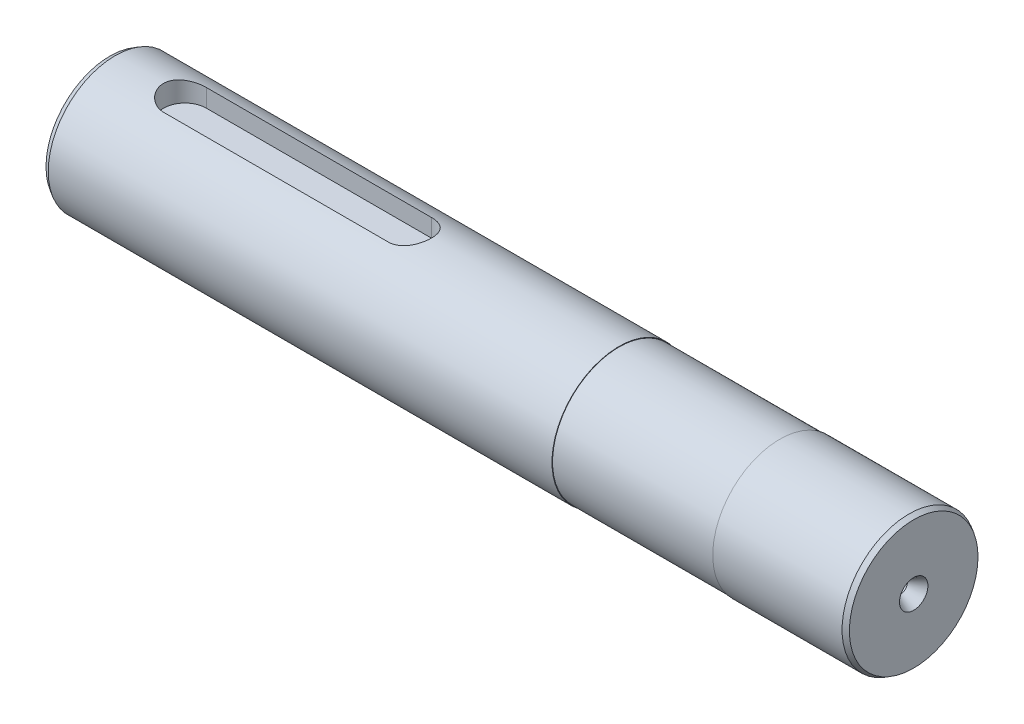
ISO-10303-21;
HEADER;
FILE_DESCRIPTION(('STEP AP214'),'2;1');
FILE_NAME('part.step','',(''),(''),'','','');
FILE_SCHEMA(('AUTOMOTIVE_DESIGN { 1 0 10303 214 1 1 1 1 }'));
ENDSEC;
DATA;
#1=APPLICATION_CONTEXT('core data for automotive mechanical design processes');
#2=APPLICATION_PROTOCOL_DEFINITION('international standard','automotive_design',2000,#1);
#3=PRODUCT_CONTEXT('',#1,'mechanical');
#4=PRODUCT('Part','Part','',(#3));
#5=PRODUCT_RELATED_PRODUCT_CATEGORY('part','',(#4));
#6=PRODUCT_DEFINITION_FORMATION('','',#4);
#7=PRODUCT_DEFINITION_CONTEXT('part definition',#1,'design');
#8=PRODUCT_DEFINITION('design','',#6,#7);
#9=PRODUCT_DEFINITION_SHAPE('','',#8);
#10=(LENGTH_UNIT() NAMED_UNIT(*) SI_UNIT(.MILLI.,.METRE.));
#11=(NAMED_UNIT(*) PLANE_ANGLE_UNIT() SI_UNIT($,.RADIAN.));
#12=(NAMED_UNIT(*) SI_UNIT($,.STERADIAN.) SOLID_ANGLE_UNIT());
#13=UNCERTAINTY_MEASURE_WITH_UNIT(LENGTH_MEASURE(1.E-05),#10,'distance_accuracy_value','');
#14=(GEOMETRIC_REPRESENTATION_CONTEXT(3) GLOBAL_UNCERTAINTY_ASSIGNED_CONTEXT((#13)) GLOBAL_UNIT_ASSIGNED_CONTEXT((#10,
#11,#12)) REPRESENTATION_CONTEXT('',''));
#15=CARTESIAN_POINT('',(0.,0.,0.));
#16=DIRECTION('',(0.,0.,1.));
#17=DIRECTION('',(1.,0.,0.));
#18=AXIS2_PLACEMENT_3D('',#15,#16,#17);
#19=CARTESIAN_POINT('',(150.,0.,-12.));
#20=DIRECTION('',(1.,0.,0.));
#21=DIRECTION('',(0.,0.,-1.));
#22=AXIS2_PLACEMENT_3D('',#19,#20,#21);
#23=PLANE('',#22);
#24=CARTESIAN_POINT('',(150.,0.,0.));
#25=DIRECTION('',(1.,0.,0.));
#26=DIRECTION('',(0.,0.,-1.));
#27=AXIS2_PLACEMENT_3D('',#24,#25,#26);
#28=CIRCLE('',#27,12.);
#29=CARTESIAN_POINT('',(150.,0.,-12.));
#30=VERTEX_POINT('',#29);
#31=EDGE_CURVE('E130',#30,#30,#28,.T.);
#32=ORIENTED_EDGE('',*,*,#31,.T.);
#33=EDGE_LOOP('',(#32));
#34=FACE_BOUND('',#33,.T.);
#35=CARTESIAN_POINT('',(150.,0.,0.));
#36=DIRECTION('',(1.,0.,0.));
#37=DIRECTION('',(0.,1.,0.));
#38=AXIS2_PLACEMENT_3D('',#35,#36,#37);
#39=CIRCLE('',#38,2.65);
#40=CARTESIAN_POINT('',(150.,2.65,0.));
#41=VERTEX_POINT('',#40);
#42=EDGE_CURVE('E124',#41,#41,#39,.T.);
#43=ORIENTED_EDGE('',*,*,#42,.F.);
#44=EDGE_LOOP('',(#43));
#45=FACE_BOUND('',#44,.T.);
#46=ADVANCED_FACE('F39',(#34,#45),#23,.T.);
#47=CARTESIAN_POINT('',(0.,0.,0.));
#48=DIRECTION('',(-1.,0.,0.));
#49=DIRECTION('',(0.,0.,1.));
#50=AXIS2_PLACEMENT_3D('',#47,#48,#49);
#51=PLANE('',#50);
#52=CARTESIAN_POINT('',(0.,0.,0.));
#53=DIRECTION('',(-1.,0.,0.));
#54=DIRECTION('',(0.,0.,1.));
#55=AXIS2_PLACEMENT_3D('',#52,#53,#54);
#56=CIRCLE('',#55,11.9226497308104);
#57=CARTESIAN_POINT('',(0.,0.,11.9226497308104));
#58=VERTEX_POINT('',#57);
#59=EDGE_CURVE('E151',#58,#58,#56,.T.);
#60=ORIENTED_EDGE('',*,*,#59,.T.);
#61=EDGE_LOOP('',(#60));
#62=FACE_BOUND('',#61,.T.);
#63=CARTESIAN_POINT('',(0.,0.,0.));
#64=DIRECTION('',(-1.,0.,0.));
#65=DIRECTION('',(0.,0.,1.));
#66=AXIS2_PLACEMENT_3D('',#63,#64,#65);
#67=CIRCLE('',#66,4.5);
#68=CARTESIAN_POINT('',(0.,0.,4.5));
#69=VERTEX_POINT('',#68);
#70=EDGE_CURVE('E108',#69,#69,#67,.T.);
#71=ORIENTED_EDGE('',*,*,#70,.F.);
#72=EDGE_LOOP('',(#71));
#73=FACE_BOUND('',#72,.T.);
#74=ADVANCED_FACE('F190',(#62,#73),#51,.T.);
#75=CARTESIAN_POINT('',(0.,0.,0.));
#76=DIRECTION('',(1.,0.,0.));
#77=DIRECTION('',(0.,0.,-1.));
#78=AXIS2_PLACEMENT_3D('',#75,#76,#77);
#79=CYLINDRICAL_SURFACE('',#78,12.5);
#80=CARTESIAN_POINT('',(56.0000000000001,11.842719282327,4.));
#81=CARTESIAN_POINT('',(56.1093997719617,11.8427027366058,4.00001410484613));
#82=CARTESIAN_POINT('',(56.218790209848,11.8442348052368,3.995512175201));
#83=CARTESIAN_POINT('',(56.4367282407365,11.8502730910574,3.97758606678449));
#84=CARTESIAN_POINT('',(56.5452760384846,11.8547785613244,3.96416412872571));
#85=CARTESIAN_POINT('',(56.7604610308456,11.8666242076309,3.92855725119429));
#86=CARTESIAN_POINT('',(56.8671026956113,11.8739564736691,3.9063967602145));
#87=CARTESIAN_POINT('',(57.0780056383716,11.8912164993788,3.85353581488656));
#88=CARTESIAN_POINT('',(57.1822668401568,11.90114434202,3.82283508754056));
#89=CARTESIAN_POINT('',(57.4903050042784,11.9343840843196,3.71831764495512));
#90=CARTESIAN_POINT('',(57.6896365520681,11.9611699822066,3.63203544139887));
#91=CARTESIAN_POINT('',(58.0710125570419,12.0209583955878,3.42895021192288));
#92=CARTESIAN_POINT('',(58.2530473790497,12.0539643457894,3.31213030924909));
#93=CARTESIAN_POINT('',(58.6012539885993,12.123798407807,3.0467850788479));
#94=CARTESIAN_POINT('',(58.7667183243395,12.1607158548651,2.89735303896514));
#95=CARTESIAN_POINT('',(59.070714848589,12.2334561140966,2.57296449846116));
#96=CARTESIAN_POINT('',(59.2092423483578,12.2692787347869,2.39800356343232));
#97=CARTESIAN_POINT('',(59.4586151983706,12.3368244653945,2.02237003010511));
#98=CARTESIAN_POINT('',(59.5687219564697,12.3684294972003,1.82118394546976));
#99=CARTESIAN_POINT('',(59.7532494953495,12.4229251649937,1.40197197350368));
#100=CARTESIAN_POINT('',(59.827680473782,12.4458182908278,1.18395091903581));
#101=CARTESIAN_POINT('',(59.9363588642506,12.4796767811416,0.744713961063363));
#102=CARTESIAN_POINT('',(59.9718249333802,12.4910030499338,0.523827920101154));
#103=CARTESIAN_POINT('',(60.0054327990417,12.5017287122873,0.0789648151746378));
#104=CARTESIAN_POINT('',(60.0035827335249,12.5011307063103,-0.145011564197641));
#105=CARTESIAN_POINT('',(59.9634011707287,12.4883236673358,-0.58109497443769));
#106=CARTESIAN_POINT('',(59.9263922320213,12.4765355800409,-0.793338226675237));
#107=CARTESIAN_POINT('',(59.8191194483938,12.443194578958,-1.2084232001272));
#108=CARTESIAN_POINT('',(59.7488537925673,12.4216411334261,-1.41126440871778));
#109=CARTESIAN_POINT('',(59.5762421577643,12.3706364987475,-1.80478548808183));
#110=CARTESIAN_POINT('',(59.4735034801313,12.3410893067347,-1.99528012693527));
#111=CARTESIAN_POINT('',(59.2391709509549,12.2771965403044,-2.35673113106229));
#112=CARTESIAN_POINT('',(59.1075697935971,12.2428497517893,-2.52768253275751));
#113=CARTESIAN_POINT('',(58.8125534687085,12.1712409097156,-2.85304511528221));
#114=CARTESIAN_POINT('',(58.648003297408,12.1339170352569,-3.00641313381737));
#115=CARTESIAN_POINT('',(58.2950280999148,12.0618172896256,-3.28377291775702));
#116=CARTESIAN_POINT('',(58.1065957411679,12.0270422062066,-3.40775562728565));
#117=CARTESIAN_POINT('',(57.8086287622515,11.9796198433082,-3.56958208232607));
#118=CARTESIAN_POINT('',(57.7060009407585,11.9645161845072,-3.61975674493765));
#119=CARTESIAN_POINT('',(57.4965952472484,11.9364591580623,-3.71123075156255));
#120=CARTESIAN_POINT('',(57.3898191122137,11.9235049021446,-3.75253376401034));
#121=CARTESIAN_POINT('',(57.1729866721085,11.9001802342949,-3.82585831579178));
#122=CARTESIAN_POINT('',(57.062934022027,11.889807055759,-3.85788979915529));
#123=CARTESIAN_POINT('',(56.8403048430525,11.8719756673203,-3.91241790563964));
#124=CARTESIAN_POINT('',(56.7277294962027,11.8645161211931,-3.93491889994976));
#125=CARTESIAN_POINT('',(56.5127607541391,11.8533815888388,-3.96832908530804));
#126=CARTESIAN_POINT('',(56.4105325842055,11.8493925948395,-3.9802038456482));
#127=CARTESIAN_POINT('',(56.2055389219667,11.8440568016292,-3.99603937127681));
#128=CARTESIAN_POINT('',(56.1027743617195,11.8427063770563,-4.00001099551563));
#129=CARTESIAN_POINT('',(56.0000000000001,11.842719282327,-4.));
#130=B_SPLINE_CURVE_WITH_KNOTS('',3,(#80,#81,#82,#83,#84,#85,#86,#87,#88,#89,#90,#91,#92,#93,
#94,#95,#96,#97,#98,#99,#100,#101,#102,#103,#104,#105,#106,#107,#108,#109,#110,#111,#112,#113,
#114,#115,#116,#117,#118,#119,#120,#121,#122,#123,#124,#125,#126,#127,#128,#129),.UNSPECIFIED.,
.F.,.F.,(4,2,2,2,2,2,2,2,2,2,2,2,2,2,2,2,2,2,2,2,2,2,2,2,4),(0.,0.328080176984104,
0.656077971124949,0.983164539368213,1.310261564488,1.96355293984248,2.61720612481382,
3.29209427898756,3.96709980211697,4.65819584662374,5.34909422856993,6.01770820975085,
6.68617638029993,7.3304550155383,7.97476873730064,8.62719320105811,9.27978300073407,
9.96076419384897,10.6419549776068,10.9872862883783,11.3324745283028,11.6772911585126,
12.0219494657669,12.3305938648259,12.6388138912331),.UNSPECIFIED.);
#131=CARTESIAN_POINT('',(56.0000000000001,11.842719282327,4.));
#132=VERTEX_POINT('',#131);
#133=CARTESIAN_POINT('',(56.0000000000001,11.842719282327,-4.));
#134=VERTEX_POINT('',#133);
#135=EDGE_CURVE('E154',#132,#134,#130,.T.);
#136=ORIENTED_EDGE('',*,*,#135,.F.);
#137=DIRECTION('',(1.,0.,0.));
#138=VECTOR('',#137,1.);
#139=CARTESIAN_POINT('',(0.,11.842719282327,4.));
#140=LINE('',#139,#138);
#141=CARTESIAN_POINT('',(14.0000000000001,11.842719282327,4.));
#142=VERTEX_POINT('',#141);
#143=EDGE_CURVE('E11',#142,#132,#140,.T.);
#144=ORIENTED_EDGE('',*,*,#143,.F.);
#145=CARTESIAN_POINT('',(14.0000000000001,11.842719282327,-4.));
#146=CARTESIAN_POINT('',(13.8906002280385,11.8427027366058,-4.00001410484613));
#147=CARTESIAN_POINT('',(13.7812097901522,11.8442348052368,-3.995512175201));
#148=CARTESIAN_POINT('',(13.5632717592636,11.8502730910574,-3.9775860667845));
#149=CARTESIAN_POINT('',(13.4547239615156,11.8547785613244,-3.96416412872571));
#150=CARTESIAN_POINT('',(13.2395389691546,11.8666242076309,-3.9285572511943));
#151=CARTESIAN_POINT('',(13.1328973043888,11.8739564736691,-3.9063967602145));
#152=CARTESIAN_POINT('',(12.9219943616285,11.8912164993788,-3.85353581488657));
#153=CARTESIAN_POINT('',(12.8177331598433,11.90114434202,-3.82283508754056));
#154=CARTESIAN_POINT('',(12.5096949957217,11.9343840843196,-3.71831764495513));
#155=CARTESIAN_POINT('',(12.310363447932,11.9611699822066,-3.63203544139888));
#156=CARTESIAN_POINT('',(11.9289874429582,12.0209583955878,-3.42895021192288));
#157=CARTESIAN_POINT('',(11.7469526209504,12.0539643457894,-3.3121303092491));
#158=CARTESIAN_POINT('',(11.3987460114009,12.123798407807,-3.0467850788479));
#159=CARTESIAN_POINT('',(11.2332816756606,12.1607158548651,-2.89735303896515));
#160=CARTESIAN_POINT('',(10.9292851514112,12.2334561140966,-2.57296449846117));
#161=CARTESIAN_POINT('',(10.7907576516424,12.2692787347869,-2.39800356343233));
#162=CARTESIAN_POINT('',(10.5413848016295,12.3368244653945,-2.02237003010512));
#163=CARTESIAN_POINT('',(10.4312780435304,12.3684294972003,-1.82118394546976));
#164=CARTESIAN_POINT('',(10.2467505046507,12.4229251649937,-1.40197197350369));
#165=CARTESIAN_POINT('',(10.1723195262182,12.4458182908278,-1.18395091903581));
#166=CARTESIAN_POINT('',(10.0636411357496,12.4796767811416,-0.744713961063364));
#167=CARTESIAN_POINT('',(10.02817506662,12.4910030499338,-0.523827920101155));
#168=CARTESIAN_POINT('',(9.99456720095843,12.5017287122873,-0.0789648151746373));
#169=CARTESIAN_POINT('',(9.99641726647523,12.5011307063103,0.145011564197642));
#170=CARTESIAN_POINT('',(10.0365988292714,12.4883236673358,0.581094974437692));
#171=CARTESIAN_POINT('',(10.0736077679789,12.4765355800409,0.793338226675239));
#172=CARTESIAN_POINT('',(10.1808805516064,12.443194578958,1.2084232001272));
#173=CARTESIAN_POINT('',(10.2511462074329,12.4216411334261,1.41126440871778));
#174=CARTESIAN_POINT('',(10.4237578422358,12.3706364987475,1.80478548808183));
#175=CARTESIAN_POINT('',(10.5264965198689,12.3410893067347,1.99528012693527));
#176=CARTESIAN_POINT('',(10.7608290490453,12.2771965403044,2.35673113106229));
#177=CARTESIAN_POINT('',(10.8924302064031,12.2428497517893,2.5276825327575));
#178=CARTESIAN_POINT('',(11.1874465312916,12.1712409097156,2.85304511528221));
#179=CARTESIAN_POINT('',(11.3519967025922,12.1339170352569,3.00641313381737));
#180=CARTESIAN_POINT('',(11.7049719000854,12.0618172896256,3.28377291775701));
#181=CARTESIAN_POINT('',(11.8934042588322,12.0270422062066,3.40775562728565));
#182=CARTESIAN_POINT('',(12.1913712377487,11.9796198433082,3.56958208232607));
#183=CARTESIAN_POINT('',(12.2939990592416,11.9645161845072,3.61975674493765));
#184=CARTESIAN_POINT('',(12.5034047527518,11.9364591580623,3.71123075156255));
#185=CARTESIAN_POINT('',(12.6101808877865,11.9235049021446,3.75253376401034));
#186=CARTESIAN_POINT('',(12.8270133278917,11.9001802342949,3.82585831579178));
#187=CARTESIAN_POINT('',(12.9370659779732,11.889807055759,3.85788979915529));
#188=CARTESIAN_POINT('',(13.1596951569477,11.8719756673203,3.91241790563964));
#189=CARTESIAN_POINT('',(13.2722705037975,11.8645161211931,3.93491889994975));
#190=CARTESIAN_POINT('',(13.4872392458611,11.8533815888388,3.96832908530803));
#191=CARTESIAN_POINT('',(13.5894674157947,11.8493925948395,3.9802038456482));
#192=CARTESIAN_POINT('',(13.7944610780334,11.8440568016292,3.99603937127681));
#193=CARTESIAN_POINT('',(13.8972256382806,11.8427063770563,4.00001099551563));
#194=CARTESIAN_POINT('',(14.0000000000001,11.842719282327,4.));
#195=B_SPLINE_CURVE_WITH_KNOTS('',3,(#145,#146,#147,#148,#149,#150,#151,#152,#153,#154,#155,
#156,#157,#158,#159,#160,#161,#162,#163,#164,#165,#166,#167,#168,#169,#170,#171,#172,#173,#174,
#175,#176,#177,#178,#179,#180,#181,#182,#183,#184,#185,#186,#187,#188,#189,#190,#191,#192,#193,
#194),.UNSPECIFIED.,.F.,.F.,(4,2,2,2,2,2,2,2,2,2,2,2,2,2,2,2,2,2,2,2,2,2,2,2,4),(0.,
0.328080176984102,0.656077971124948,0.983164539368217,1.310261564488,1.96355293984248,
2.61720612481382,3.29209427898756,3.96709980211697,4.65819584662373,5.34909422856993,
6.01770820975086,6.68617638029994,7.3304550155383,7.97476873730065,8.62719320105811,
9.27978300073407,9.96076419384898,10.6419549776068,10.9872862883783,11.3324745283028,
11.6772911585126,12.0219494657669,12.3305938648259,12.6388138912331),.UNSPECIFIED.);
#196=CARTESIAN_POINT('',(14.0000000000001,11.842719282327,-4.));
#197=VERTEX_POINT('',#196);
#198=EDGE_CURVE('E47',#197,#142,#195,.T.);
#199=ORIENTED_EDGE('',*,*,#198,.F.);
#200=DIRECTION('',(1.,0.,0.));
#201=VECTOR('',#200,1.);
#202=CARTESIAN_POINT('',(0.,11.842719282327,-4.));
#203=LINE('',#202,#201);
#204=EDGE_CURVE('E161',#134,#197,#203,.F.);
#205=ORIENTED_EDGE('',*,*,#204,.F.);
#206=EDGE_LOOP('',(#136,#144,#199,#205));
#207=FACE_BOUND('',#206,.T.);
#208=CARTESIAN_POINT('',(1.00000000000004,0.,0.));
#209=DIRECTION('',(-1.,0.,0.));
#210=DIRECTION('',(0.,0.,1.));
#211=AXIS2_PLACEMENT_3D('',#208,#209,#210);
#212=CIRCLE('',#211,12.5);
#213=CARTESIAN_POINT('',(1.00000000000004,0.,12.5));
#214=VERTEX_POINT('',#213);
#215=EDGE_CURVE('E148',#214,#214,#212,.F.);
#216=ORIENTED_EDGE('',*,*,#215,.T.);
#217=EDGE_LOOP('',(#216));
#218=FACE_BOUND('',#217,.T.);
#219=CARTESIAN_POINT('',(95.,0.,0.));
#220=DIRECTION('',(1.,0.,0.));
#221=DIRECTION('',(0.,0.,-1.));
#222=AXIS2_PLACEMENT_3D('',#219,#220,#221);
#223=CIRCLE('',#222,12.5);
#224=CARTESIAN_POINT('',(95.,0.,-12.5));
#225=VERTEX_POINT('',#224);
#226=EDGE_CURVE('E145',#225,#225,#223,.T.);
#227=ORIENTED_EDGE('',*,*,#226,.F.);
#228=EDGE_LOOP('',(#227));
#229=FACE_BOUND('',#228,.T.);
#230=ADVANCED_FACE('F162',(#207,#218,#229),#79,.T.);
#231=CARTESIAN_POINT('',(95.,0.,-12.5));
#232=DIRECTION('',(1.,0.,0.));
#233=DIRECTION('',(0.,0.,-1.));
#234=AXIS2_PLACEMENT_3D('',#231,#232,#233);
#235=PLANE('',#234);
#236=ORIENTED_EDGE('',*,*,#226,.T.);
#237=EDGE_LOOP('',(#236));
#238=FACE_BOUND('',#237,.T.);
#239=CARTESIAN_POINT('',(95.,0.,0.));
#240=DIRECTION('',(1.,0.,0.));
#241=DIRECTION('',(0.,0.,-1.));
#242=AXIS2_PLACEMENT_3D('',#239,#240,#241);
#243=CIRCLE('',#242,12.4);
#244=CARTESIAN_POINT('',(95.,0.,-12.4));
#245=VERTEX_POINT('',#244);
#246=EDGE_CURVE('E142',#245,#245,#243,.T.);
#247=ORIENTED_EDGE('',*,*,#246,.F.);
#248=EDGE_LOOP('',(#247));
#249=FACE_BOUND('',#248,.T.);
#250=ADVANCED_FACE('F189',(#238,#249),#235,.T.);
#251=CARTESIAN_POINT('',(0.,0.,0.));
#252=DIRECTION('',(1.,0.,0.));
#253=DIRECTION('',(0.,0.,-1.));
#254=AXIS2_PLACEMENT_3D('',#251,#252,#253);
#255=CYLINDRICAL_SURFACE('',#254,12.4);
#256=ORIENTED_EDGE('',*,*,#246,.T.);
#257=EDGE_LOOP('',(#256));
#258=FACE_BOUND('',#257,.T.);
#259=CARTESIAN_POINT('',(125.,0.,0.));
#260=DIRECTION('',(1.,0.,0.));
#261=DIRECTION('',(0.,0.,-1.));
#262=AXIS2_PLACEMENT_3D('',#259,#260,#261);
#263=CIRCLE('',#262,12.4);
#264=CARTESIAN_POINT('',(125.,0.,-12.4));
#265=VERTEX_POINT('',#264);
#266=EDGE_CURVE('E139',#265,#265,#263,.T.);
#267=ORIENTED_EDGE('',*,*,#266,.F.);
#268=EDGE_LOOP('',(#267));
#269=FACE_BOUND('',#268,.T.);
#270=ADVANCED_FACE('F197',(#258,#269),#255,.T.);
#271=CARTESIAN_POINT('',(125.,0.,-12.5));
#272=DIRECTION('',(-1.,0.,0.));
#273=DIRECTION('',(0.,0.,1.));
#274=AXIS2_PLACEMENT_3D('',#271,#272,#273);
#275=PLANE('',#274);
#276=ORIENTED_EDGE('',*,*,#266,.T.);
#277=EDGE_LOOP('',(#276));
#278=FACE_BOUND('',#277,.T.);
#279=CARTESIAN_POINT('',(125.,0.,0.));
#280=DIRECTION('',(1.,0.,0.));
#281=DIRECTION('',(0.,0.,-1.));
#282=AXIS2_PLACEMENT_3D('',#279,#280,#281);
#283=CIRCLE('',#282,12.5);
#284=CARTESIAN_POINT('',(125.,0.,-12.5));
#285=VERTEX_POINT('',#284);
#286=EDGE_CURVE('E136',#285,#285,#283,.T.);
#287=ORIENTED_EDGE('',*,*,#286,.F.);
#288=EDGE_LOOP('',(#287));
#289=FACE_BOUND('',#288,.T.);
#290=ADVANCED_FACE('F202',(#278,#289),#275,.T.);
#291=CARTESIAN_POINT('',(0.,0.,0.));
#292=DIRECTION('',(1.,0.,0.));
#293=DIRECTION('',(0.,0.,-1.));
#294=AXIS2_PLACEMENT_3D('',#291,#292,#293);
#295=CYLINDRICAL_SURFACE('',#294,12.5);
#296=ORIENTED_EDGE('',*,*,#286,.T.);
#297=EDGE_LOOP('',(#296));
#298=FACE_BOUND('',#297,.T.);
#299=CARTESIAN_POINT('',(149.133974596216,0.,0.));
#300=DIRECTION('',(1.,0.,0.));
#301=DIRECTION('',(0.,0.,-1.));
#302=AXIS2_PLACEMENT_3D('',#299,#300,#301);
#303=CIRCLE('',#302,12.5);
#304=CARTESIAN_POINT('',(149.133974596216,0.,-12.5));
#305=VERTEX_POINT('',#304);
#306=EDGE_CURVE('E133',#305,#305,#303,.T.);
#307=ORIENTED_EDGE('',*,*,#306,.F.);
#308=EDGE_LOOP('',(#307));
#309=FACE_BOUND('',#308,.T.);
#310=ADVANCED_FACE('F208',(#298,#309),#295,.T.);
#311=CARTESIAN_POINT('',(150.,0.,0.));
#312=DIRECTION('',(-1.,0.,0.));
#313=DIRECTION('',(0.,0.,1.));
#314=AXIS2_PLACEMENT_3D('',#311,#312,#313);
#315=CONICAL_SURFACE('',#314,12.,0.523598775598285);
#316=ORIENTED_EDGE('',*,*,#306,.T.);
#317=EDGE_LOOP('',(#316));
#318=FACE_BOUND('',#317,.T.);
#319=ORIENTED_EDGE('',*,*,#31,.F.);
#320=EDGE_LOOP('',(#319));
#321=FACE_BOUND('',#320,.T.);
#322=ADVANCED_FACE('F214',(#318,#321),#315,.T.);
#323=CARTESIAN_POINT('',(150.,0.,0.));
#324=DIRECTION('',(1.,0.,0.));
#325=DIRECTION('',(0.,1.,0.));
#326=AXIS2_PLACEMENT_3D('',#323,#324,#325);
#327=CYLINDRICAL_SURFACE('',#326,1.25);
#328=CARTESIAN_POINT('',(147.575128869404,0.,0.));
#329=DIRECTION('',(1.,0.,0.));
#330=DIRECTION('',(0.,1.,0.));
#331=AXIS2_PLACEMENT_3D('',#328,#329,#330);
#332=CIRCLE('',#331,1.25);
#333=CARTESIAN_POINT('',(147.575128869404,1.25,0.));
#334=VERTEX_POINT('',#333);
#335=EDGE_CURVE('E121',#334,#334,#332,.T.);
#336=ORIENTED_EDGE('',*,*,#335,.T.);
#337=EDGE_LOOP('',(#336));
#338=FACE_BOUND('',#337,.T.);
#339=CARTESIAN_POINT('',(145.4,0.,0.));
#340=DIRECTION('',(1.,0.,0.));
#341=DIRECTION('',(0.,1.,0.));
#342=AXIS2_PLACEMENT_3D('',#339,#340,#341);
#343=CIRCLE('',#342,1.25);
#344=CARTESIAN_POINT('',(145.4,1.25,0.));
#345=VERTEX_POINT('',#344);
#346=EDGE_CURVE('E127',#345,#345,#343,.T.);
#347=ORIENTED_EDGE('',*,*,#346,.F.);
#348=EDGE_LOOP('',(#347));
#349=FACE_BOUND('',#348,.T.);
#350=ADVANCED_FACE('F220',(#338,#349),#327,.F.);
#351=CARTESIAN_POINT('',(144.648924226216,0.,0.));
#352=DIRECTION('',(1.,0.,0.));
#353=DIRECTION('',(0.,1.,0.));
#354=AXIS2_PLACEMENT_3D('',#351,#352,#353);
#355=CONICAL_SURFACE('',#354,0.,1.02974425867664);
#356=ORIENTED_EDGE('',*,*,#346,.T.);
#357=EDGE_LOOP('',(#356));
#358=FACE_BOUND('',#357,.T.);
#359=CARTESIAN_POINT('',(144.648924226216,0.,0.));
#360=VERTEX_POINT('',#359);
#361=VERTEX_LOOP('',#360);
#362=FACE_BOUND('',#361,.T.);
#363=ADVANCED_FACE('F233',(#358,#362),#355,.F.);
#364=CARTESIAN_POINT('',(147.575128869404,0.,0.));
#365=DIRECTION('',(1.,0.,0.));
#366=DIRECTION('',(0.,1.,0.));
#367=AXIS2_PLACEMENT_3D('',#364,#365,#366);
#368=CONICAL_SURFACE('',#367,1.25,0.523598775598291);
#369=ORIENTED_EDGE('',*,*,#42,.T.);
#370=EDGE_LOOP('',(#369));
#371=FACE_BOUND('',#370,.T.);
#372=ORIENTED_EDGE('',*,*,#335,.F.);
#373=EDGE_LOOP('',(#372));
#374=FACE_BOUND('',#373,.T.);
#375=ADVANCED_FACE('F229',(#371,#374),#368,.F.);
#376=CARTESIAN_POINT('',(22.25,0.,0.));
#377=DIRECTION('',(-1.,0.,0.));
#378=DIRECTION('',(0.,0.,1.));
#379=AXIS2_PLACEMENT_3D('',#376,#377,#378);
#380=CONICAL_SURFACE('',#379,3.4,1.02974425867665);
#381=CARTESIAN_POINT('',(24.2929261046937,0.,0.));
#382=VERTEX_POINT('',#381);
#383=VERTEX_LOOP('',#382);
#384=FACE_BOUND('',#383,.T.);
#385=CARTESIAN_POINT('',(22.25,0.,0.));
#386=DIRECTION('',(-1.,0.,0.));
#387=DIRECTION('',(0.,0.,1.));
#388=AXIS2_PLACEMENT_3D('',#385,#386,#387);
#389=CIRCLE('',#388,3.4);
#390=CARTESIAN_POINT('',(22.25,0.,3.4));
#391=VERTEX_POINT('',#390);
#392=EDGE_CURVE('E118',#391,#391,#389,.T.);
#393=ORIENTED_EDGE('',*,*,#392,.T.);
#394=EDGE_LOOP('',(#393));
#395=FACE_BOUND('',#394,.T.);
#396=ADVANCED_FACE('F232',(#384,#395),#380,.F.);
#397=CARTESIAN_POINT('',(0.,0.,0.));
#398=DIRECTION('',(-1.,0.,0.));
#399=DIRECTION('',(0.,0.,1.));
#400=AXIS2_PLACEMENT_3D('',#397,#398,#399);
#401=CYLINDRICAL_SURFACE('',#400,3.4);
#402=ORIENTED_EDGE('',*,*,#392,.F.);
#403=EDGE_LOOP('',(#402));
#404=FACE_BOUND('',#403,.T.);
#405=CARTESIAN_POINT('',(1.90525588832577,0.,0.));
#406=DIRECTION('',(-1.,0.,0.));
#407=DIRECTION('',(0.,0.,1.));
#408=AXIS2_PLACEMENT_3D('',#405,#406,#407);
#409=CIRCLE('',#408,3.4);
#410=CARTESIAN_POINT('',(1.90525588832577,0.,3.4));
#411=VERTEX_POINT('',#410);
#412=EDGE_CURVE('E115',#411,#411,#409,.T.);
#413=ORIENTED_EDGE('',*,*,#412,.T.);
#414=EDGE_LOOP('',(#413));
#415=FACE_BOUND('',#414,.T.);
#416=ADVANCED_FACE('F248',(#404,#415),#401,.F.);
#417=CARTESIAN_POINT('',(0.,0.,0.));
#418=DIRECTION('',(-1.,0.,0.));
#419=DIRECTION('',(0.,0.,1.));
#420=AXIS2_PLACEMENT_3D('',#417,#418,#419);
#421=CONICAL_SURFACE('',#420,4.5,0.523598775598299);
#422=ORIENTED_EDGE('',*,*,#412,.F.);
#423=EDGE_LOOP('',(#422));
#424=FACE_BOUND('',#423,.T.);
#425=ORIENTED_EDGE('',*,*,#70,.T.);
#426=EDGE_LOOP('',(#425));
#427=FACE_BOUND('',#426,.T.);
#428=ADVANCED_FACE('F178',(#424,#427),#421,.F.);
#429=CARTESIAN_POINT('',(1.00000000000004,0.,0.));
#430=DIRECTION('',(1.,0.,0.));
#431=DIRECTION('',(0.,0.,-1.));
#432=AXIS2_PLACEMENT_3D('',#429,#430,#431);
#433=CONICAL_SURFACE('',#432,12.5,0.523598775598299);
#434=ORIENTED_EDGE('',*,*,#59,.F.);
#435=EDGE_LOOP('',(#434));
#436=FACE_BOUND('',#435,.T.);
#437=ORIENTED_EDGE('',*,*,#215,.F.);
#438=EDGE_LOOP('',(#437));
#439=FACE_BOUND('',#438,.T.);
#440=ADVANCED_FACE('F41',(#436,#439),#433,.T.);
#441=CARTESIAN_POINT('',(14.0000000000001,8.5,0.));
#442=DIRECTION('',(0.,1.,0.));
#443=DIRECTION('',(0.,0.,1.));
#444=AXIS2_PLACEMENT_3D('',#441,#442,#443);
#445=CYLINDRICAL_SURFACE('',#444,4.);
#446=DIRECTION('',(0.,1.,0.));
#447=VECTOR('',#446,1.);
#448=CARTESIAN_POINT('',(14.0000000000001,8.50000000000002,-4.00000000000002));
#449=LINE('',#448,#447);
#450=CARTESIAN_POINT('',(14.0000000000001,8.50000000000002,-4.00000000000002));
#451=VERTEX_POINT('',#450);
#452=EDGE_CURVE('E106',#451,#197,#449,.T.);
#453=ORIENTED_EDGE('',*,*,#452,.T.);
#454=ORIENTED_EDGE('',*,*,#198,.T.);
#455=DIRECTION('',(0.,1.,0.));
#456=VECTOR('',#455,1.);
#457=CARTESIAN_POINT('',(14.0000000000001,8.49999999999999,3.99999999999999));
#458=LINE('',#457,#456);
#459=CARTESIAN_POINT('',(14.0000000000001,8.49999999999999,3.99999999999999));
#460=VERTEX_POINT('',#459);
#461=EDGE_CURVE('E53',#460,#142,#458,.T.);
#462=ORIENTED_EDGE('',*,*,#461,.F.);
#463=CARTESIAN_POINT('',(14.0000000000001,8.5,0.));
#464=DIRECTION('',(0.,1.,0.));
#465=DIRECTION('',(0.,0.,1.));
#466=AXIS2_PLACEMENT_3D('',#463,#464,#465);
#467=CIRCLE('',#466,4.);
#468=EDGE_CURVE('E85',#451,#460,#467,.T.);
#469=ORIENTED_EDGE('',*,*,#468,.F.);
#470=EDGE_LOOP('',(#453,#454,#462,#469));
#471=FACE_BOUND('',#470,.T.);
#472=ADVANCED_FACE('F83',(#471),#445,.F.);
#473=CARTESIAN_POINT('',(14.0000000000001,8.50000000000002,-4.00000000000002));
#474=DIRECTION('',(0.,0.,-1.));
#475=DIRECTION('',(0.,1.,0.));
#476=AXIS2_PLACEMENT_3D('',#473,#474,#475);
#477=PLANE('',#476);
#478=ORIENTED_EDGE('',*,*,#204,.T.);
#479=ORIENTED_EDGE('',*,*,#452,.F.);
#480=DIRECTION('',(-1.,0.,0.));
#481=VECTOR('',#480,1.);
#482=CARTESIAN_POINT('',(14.0000000000001,8.50000000000002,-4.00000000000002));
#483=LINE('',#482,#481);
#484=CARTESIAN_POINT('',(56.0000000000001,8.50000000000002,-4.00000000000002));
#485=VERTEX_POINT('',#484);
#486=EDGE_CURVE('E89',#485,#451,#483,.T.);
#487=ORIENTED_EDGE('',*,*,#486,.F.);
#488=DIRECTION('',(0.,1.,0.));
#489=VECTOR('',#488,1.);
#490=CARTESIAN_POINT('',(56.0000000000001,8.50000000000002,-4.00000000000002));
#491=LINE('',#490,#489);
#492=EDGE_CURVE('E109',#485,#134,#491,.T.);
#493=ORIENTED_EDGE('',*,*,#492,.T.);
#494=EDGE_LOOP('',(#478,#479,#487,#493));
#495=FACE_BOUND('',#494,.T.);
#496=ADVANCED_FACE('F170',(#495),#477,.F.);
#497=CARTESIAN_POINT('',(56.0000000000001,8.5,0.));
#498=DIRECTION('',(0.,1.,0.));
#499=DIRECTION('',(0.,0.,1.));
#500=AXIS2_PLACEMENT_3D('',#497,#498,#499);
#501=CYLINDRICAL_SURFACE('',#500,4.);
#502=DIRECTION('',(0.,1.,0.));
#503=VECTOR('',#502,1.);
#504=CARTESIAN_POINT('',(56.0000000000001,8.49999999999999,3.99999999999999));
#505=LINE('',#504,#503);
#506=CARTESIAN_POINT('',(56.0000000000001,8.49999999999999,3.99999999999999));
#507=VERTEX_POINT('',#506);
#508=EDGE_CURVE('E88',#507,#132,#505,.T.);
#509=ORIENTED_EDGE('',*,*,#508,.T.);
#510=ORIENTED_EDGE('',*,*,#135,.T.);
#511=ORIENTED_EDGE('',*,*,#492,.F.);
#512=CARTESIAN_POINT('',(56.0000000000001,8.5,0.));
#513=DIRECTION('',(0.,1.,0.));
#514=DIRECTION('',(0.,0.,1.));
#515=AXIS2_PLACEMENT_3D('',#512,#513,#514);
#516=CIRCLE('',#515,4.);
#517=EDGE_CURVE('E98',#507,#485,#516,.T.);
#518=ORIENTED_EDGE('',*,*,#517,.F.);
#519=EDGE_LOOP('',(#509,#510,#511,#518));
#520=FACE_BOUND('',#519,.T.);
#521=ADVANCED_FACE('F165',(#520),#501,.F.);
#522=CARTESIAN_POINT('',(14.0000000000001,8.49999999999999,3.99999999999999));
#523=DIRECTION('',(0.,0.,1.));
#524=DIRECTION('',(0.,-1.,0.));
#525=AXIS2_PLACEMENT_3D('',#522,#523,#524);
#526=PLANE('',#525);
#527=ORIENTED_EDGE('',*,*,#143,.T.);
#528=ORIENTED_EDGE('',*,*,#508,.F.);
#529=DIRECTION('',(1.,0.,0.));
#530=VECTOR('',#529,1.);
#531=CARTESIAN_POINT('',(14.0000000000001,8.49999999999999,3.99999999999999));
#532=LINE('',#531,#530);
#533=EDGE_CURVE('E92',#460,#507,#532,.T.);
#534=ORIENTED_EDGE('',*,*,#533,.F.);
#535=ORIENTED_EDGE('',*,*,#461,.T.);
#536=EDGE_LOOP('',(#527,#528,#534,#535));
#537=FACE_BOUND('',#536,.T.);
#538=ADVANCED_FACE('F93',(#537),#526,.F.);
#539=CARTESIAN_POINT('',(14.0000000000001,8.5,0.));
#540=DIRECTION('',(0.,1.,0.));
#541=DIRECTION('',(0.,0.,1.));
#542=AXIS2_PLACEMENT_3D('',#539,#540,#541);
#543=PLANE('',#542);
#544=ORIENTED_EDGE('',*,*,#468,.T.);
#545=ORIENTED_EDGE('',*,*,#533,.T.);
#546=ORIENTED_EDGE('',*,*,#517,.T.);
#547=ORIENTED_EDGE('',*,*,#486,.T.);
#548=EDGE_LOOP('',(#544,#545,#546,#547));
#549=FACE_BOUND('',#548,.T.);
#550=ADVANCED_FACE('F100',(#549),#543,.T.);
#551=CLOSED_SHELL('',(#46,#74,#230,#250,#270,#290,#310,#322,#350,#363,#375,#396,#416,#428,#440,
#472,#496,#521,#538,#550));
#552=MANIFOLD_SOLID_BREP('B2',#551);
#553=ADVANCED_BREP_SHAPE_REPRESENTATION('',(#18,#552),#14);
#554=SHAPE_DEFINITION_REPRESENTATION(#9,#553);
ENDSEC;
END-ISO-10303-21;
